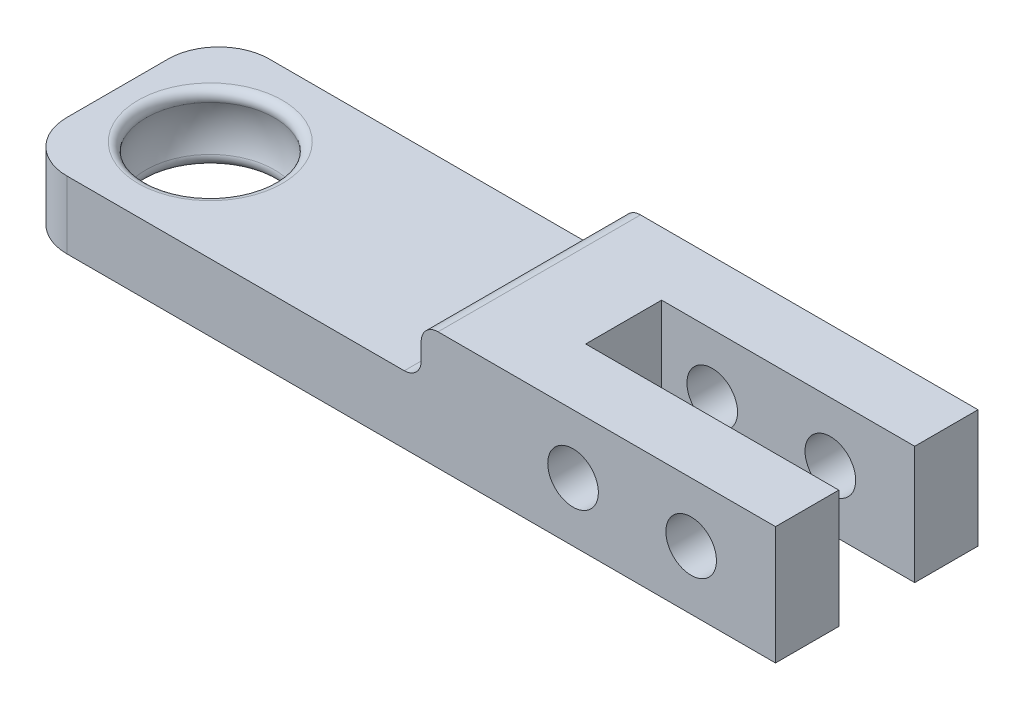
ISO-10303-21;
HEADER;
FILE_DESCRIPTION(('STEP AP214'),'2;1');
FILE_NAME('part.step','',(''),(''),'','','');
FILE_SCHEMA(('AUTOMOTIVE_DESIGN { 1 0 10303 214 1 1 1 1 }'));
ENDSEC;
DATA;
#1=APPLICATION_CONTEXT('core data for automotive mechanical design processes');
#2=APPLICATION_PROTOCOL_DEFINITION('international standard','automotive_design',2000,#1);
#3=PRODUCT_CONTEXT('',#1,'mechanical');
#4=PRODUCT('Part','Part','',(#3));
#5=PRODUCT_RELATED_PRODUCT_CATEGORY('part','',(#4));
#6=PRODUCT_DEFINITION_FORMATION('','',#4);
#7=PRODUCT_DEFINITION_CONTEXT('part definition',#1,'design');
#8=PRODUCT_DEFINITION('design','',#6,#7);
#9=PRODUCT_DEFINITION_SHAPE('','',#8);
#10=(LENGTH_UNIT() NAMED_UNIT(*) SI_UNIT(.MILLI.,.METRE.));
#11=(NAMED_UNIT(*) PLANE_ANGLE_UNIT() SI_UNIT($,.RADIAN.));
#12=(NAMED_UNIT(*) SI_UNIT($,.STERADIAN.) SOLID_ANGLE_UNIT());
#13=UNCERTAINTY_MEASURE_WITH_UNIT(LENGTH_MEASURE(1.E-05),#10,'distance_accuracy_value','');
#14=(GEOMETRIC_REPRESENTATION_CONTEXT(3) GLOBAL_UNCERTAINTY_ASSIGNED_CONTEXT((#13)) GLOBAL_UNIT_ASSIGNED_CONTEXT((#10,
#11,#12)) REPRESENTATION_CONTEXT('',''));
#15=CARTESIAN_POINT('',(0.,0.,0.));
#16=DIRECTION('',(0.,0.,1.));
#17=DIRECTION('',(1.,0.,0.));
#18=AXIS2_PLACEMENT_3D('',#15,#16,#17);
#19=CARTESIAN_POINT('',(22.5,2.,-6.));
#20=DIRECTION('',(-1.,0.,0.));
#21=DIRECTION('',(0.,0.,1.));
#22=AXIS2_PLACEMENT_3D('',#19,#20,#21);
#23=PLANE('',#22);
#24=DIRECTION('',(0.,1.,0.));
#25=VECTOR('',#24,1.);
#26=CARTESIAN_POINT('',(22.5,2.,-2.25));
#27=LINE('',#26,#25);
#28=CARTESIAN_POINT('',(22.5,-2.,-2.25));
#29=VERTEX_POINT('',#28);
#30=CARTESIAN_POINT('',(22.5,5.,-2.25));
#31=VERTEX_POINT('',#30);
#32=EDGE_CURVE('E194',#29,#31,#27,.T.);
#33=ORIENTED_EDGE('',*,*,#32,.F.);
#34=DIRECTION('',(0.,0.,1.));
#35=VECTOR('',#34,1.);
#36=CARTESIAN_POINT('',(22.5,-2.,-6.));
#37=LINE('',#36,#35);
#38=CARTESIAN_POINT('',(22.5,-2.,-6.));
#39=VERTEX_POINT('',#38);
#40=EDGE_CURVE('E149',#29,#39,#37,.F.);
#41=ORIENTED_EDGE('',*,*,#40,.T.);
#42=DIRECTION('',(0.,-1.,0.));
#43=VECTOR('',#42,1.);
#44=CARTESIAN_POINT('',(22.5,2.,-6.));
#45=LINE('',#44,#43);
#46=CARTESIAN_POINT('',(22.5,5.,-6.));
#47=VERTEX_POINT('',#46);
#48=EDGE_CURVE('E141',#47,#39,#45,.T.);
#49=ORIENTED_EDGE('',*,*,#48,.F.);
#50=DIRECTION('',(0.,0.,-1.));
#51=VECTOR('',#50,1.);
#52=CARTESIAN_POINT('',(22.5,5.,-2.25));
#53=LINE('',#52,#51);
#54=EDGE_CURVE('E150',#31,#47,#53,.T.);
#55=ORIENTED_EDGE('',*,*,#54,.F.);
#56=EDGE_LOOP('',(#33,#41,#49,#55));
#57=FACE_BOUND('',#56,.T.);
#58=ADVANCED_FACE('F41',(#57),#23,.F.);
#59=DIRECTION('',(0.,-1.,0.));
#60=VECTOR('',#59,1.);
#61=CARTESIAN_POINT('',(22.5,2.,2.25));
#62=LINE('',#61,#60);
#63=CARTESIAN_POINT('',(22.5,5.,2.25));
#64=VERTEX_POINT('',#63);
#65=CARTESIAN_POINT('',(22.5,-2.,2.25));
#66=VERTEX_POINT('',#65);
#67=EDGE_CURVE('E199',#64,#66,#62,.T.);
#68=ORIENTED_EDGE('',*,*,#67,.F.);
#69=DIRECTION('',(0.,0.,-1.));
#70=VECTOR('',#69,1.);
#71=CARTESIAN_POINT('',(22.5,5.,2.25));
#72=LINE('',#71,#70);
#73=CARTESIAN_POINT('',(22.5,5.,6.));
#74=VERTEX_POINT('',#73);
#75=EDGE_CURVE('E173',#74,#64,#72,.T.);
#76=ORIENTED_EDGE('',*,*,#75,.F.);
#77=DIRECTION('',(0.,-1.,0.));
#78=VECTOR('',#77,1.);
#79=CARTESIAN_POINT('',(22.5,2.,6.));
#80=LINE('',#79,#78);
#81=CARTESIAN_POINT('',(22.5,-2.,6.));
#82=VERTEX_POINT('',#81);
#83=EDGE_CURVE('E155',#74,#82,#80,.T.);
#84=ORIENTED_EDGE('',*,*,#83,.T.);
#85=DIRECTION('',(0.,0.,1.));
#86=VECTOR('',#85,1.);
#87=CARTESIAN_POINT('',(22.5,-2.,-6.));
#88=LINE('',#87,#86);
#89=EDGE_CURVE('E252',#82,#66,#88,.F.);
#90=ORIENTED_EDGE('',*,*,#89,.T.);
#91=EDGE_LOOP('',(#68,#76,#84,#90));
#92=FACE_BOUND('',#91,.T.);
#93=ADVANCED_FACE('F297',(#92),#23,.F.);
#94=CARTESIAN_POINT('',(0.,-2.,0.));
#95=DIRECTION('',(0.,1.,0.));
#96=DIRECTION('',(0.,0.,1.));
#97=AXIS2_PLACEMENT_3D('',#94,#95,#96);
#98=PLANE('',#97);
#99=CARTESIAN_POINT('',(-17.,-2.,0.));
#100=DIRECTION('',(0.,1.,0.));
#101=DIRECTION('',(0.,0.,1.));
#102=AXIS2_PLACEMENT_3D('',#99,#100,#101);
#103=CIRCLE('',#102,4.27564367951181);
#104=CARTESIAN_POINT('',(-17.,-2.,4.27564367951181));
#105=VERTEX_POINT('',#104);
#106=EDGE_CURVE('E238',#105,#105,#103,.T.);
#107=ORIENTED_EDGE('',*,*,#106,.T.);
#108=EDGE_LOOP('',(#107));
#109=FACE_BOUND('',#108,.T.);
#110=DIRECTION('',(-1.,0.,0.));
#111=VECTOR('',#110,1.);
#112=CARTESIAN_POINT('',(22.500012,-2.,2.25));
#113=LINE('',#112,#111);
#114=CARTESIAN_POINT('',(7.5,-2.,2.25));
#115=VERTEX_POINT('',#114);
#116=EDGE_CURVE('E197',#66,#115,#113,.T.);
#117=ORIENTED_EDGE('',*,*,#116,.F.);
#118=ORIENTED_EDGE('',*,*,#89,.F.);
#119=DIRECTION('',(1.,0.,0.));
#120=VECTOR('',#119,1.);
#121=CARTESIAN_POINT('',(-22.5,-2.,6.));
#122=LINE('',#121,#120);
#123=CARTESIAN_POINT('',(-19.5,-2.,6.));
#124=VERTEX_POINT('',#123);
#125=EDGE_CURVE('E212',#124,#82,#122,.T.);
#126=ORIENTED_EDGE('',*,*,#125,.F.);
#127=CARTESIAN_POINT('',(-19.5,-2.,3.));
#128=DIRECTION('',(0.,1.,0.));
#129=DIRECTION('',(0.,0.,1.));
#130=AXIS2_PLACEMENT_3D('',#127,#128,#129);
#131=CIRCLE('',#130,3.);
#132=CARTESIAN_POINT('',(-22.5,-2.,3.));
#133=VERTEX_POINT('',#132);
#134=EDGE_CURVE('E220',#124,#133,#131,.F.);
#135=ORIENTED_EDGE('',*,*,#134,.T.);
#136=DIRECTION('',(0.,0.,1.));
#137=VECTOR('',#136,1.);
#138=CARTESIAN_POINT('',(-22.5,-2.,-6.));
#139=LINE('',#138,#137);
#140=CARTESIAN_POINT('',(-22.5,-2.,-3.));
#141=VERTEX_POINT('',#140);
#142=EDGE_CURVE('E209',#141,#133,#139,.T.);
#143=ORIENTED_EDGE('',*,*,#142,.F.);
#144=CARTESIAN_POINT('',(-19.5,-2.,-3.));
#145=DIRECTION('',(0.,1.,0.));
#146=DIRECTION('',(0.,0.,1.));
#147=AXIS2_PLACEMENT_3D('',#144,#145,#146);
#148=CIRCLE('',#147,3.);
#149=CARTESIAN_POINT('',(-19.5,-2.,-6.));
#150=VERTEX_POINT('',#149);
#151=EDGE_CURVE('E216',#141,#150,#148,.F.);
#152=ORIENTED_EDGE('',*,*,#151,.T.);
#153=DIRECTION('',(-1.,0.,0.));
#154=VECTOR('',#153,1.);
#155=CARTESIAN_POINT('',(-22.5,-2.,-6.));
#156=LINE('',#155,#154);
#157=EDGE_CURVE('E215',#39,#150,#156,.T.);
#158=ORIENTED_EDGE('',*,*,#157,.F.);
#159=ORIENTED_EDGE('',*,*,#40,.F.);
#160=DIRECTION('',(-1.,0.,0.));
#161=VECTOR('',#160,1.);
#162=CARTESIAN_POINT('',(22.500012,-2.,-2.25));
#163=LINE('',#162,#161);
#164=CARTESIAN_POINT('',(7.5,-2.,-2.25));
#165=VERTEX_POINT('',#164);
#166=EDGE_CURVE('E196',#29,#165,#163,.T.);
#167=ORIENTED_EDGE('',*,*,#166,.T.);
#168=DIRECTION('',(0.,0.,-1.));
#169=VECTOR('',#168,1.);
#170=CARTESIAN_POINT('',(7.5,-2.,2.25));
#171=LINE('',#170,#169);
#172=EDGE_CURVE('E195',#115,#165,#171,.T.);
#173=ORIENTED_EDGE('',*,*,#172,.F.);
#174=EDGE_LOOP('',(#117,#118,#126,#135,#143,#152,#158,#159,#167,#173));
#175=FACE_BOUND('',#174,.T.);
#176=ADVANCED_FACE('F306',(#109,#175),#98,.F.);
#177=CARTESIAN_POINT('',(-22.5,2.,-6.));
#178=DIRECTION('',(0.,0.,1.));
#179=DIRECTION('',(1.,0.,0.));
#180=AXIS2_PLACEMENT_3D('',#177,#178,#179);
#181=PLANE('',#180);
#182=CARTESIAN_POINT('',(17.5,1.5,-6.));
#183=DIRECTION('',(0.,0.,-1.));
#184=DIRECTION('',(-1.,0.,0.));
#185=AXIS2_PLACEMENT_3D('',#182,#183,#184);
#186=CIRCLE('',#185,1.5);
#187=CARTESIAN_POINT('',(16.,1.5,-6.));
#188=VERTEX_POINT('',#187);
#189=EDGE_CURVE('E388',#188,#188,#186,.T.);
#190=ORIENTED_EDGE('',*,*,#189,.F.);
#191=EDGE_LOOP('',(#190));
#192=FACE_BOUND('',#191,.T.);
#193=CARTESIAN_POINT('',(10.5,1.5,-6.));
#194=DIRECTION('',(0.,0.,-1.));
#195=DIRECTION('',(-1.,0.,0.));
#196=AXIS2_PLACEMENT_3D('',#193,#194,#195);
#197=CIRCLE('',#196,1.5);
#198=CARTESIAN_POINT('',(9.,1.5,-6.));
#199=VERTEX_POINT('',#198);
#200=EDGE_CURVE('E392',#199,#199,#197,.T.);
#201=ORIENTED_EDGE('',*,*,#200,.F.);
#202=EDGE_LOOP('',(#201));
#203=FACE_BOUND('',#202,.T.);
#204=DIRECTION('',(0.,-1.,0.));
#205=VECTOR('',#204,1.);
#206=CARTESIAN_POINT('',(1.5,5.,-6.));
#207=LINE('',#206,#205);
#208=CARTESIAN_POINT('',(1.5,4.,-6.));
#209=VERTEX_POINT('',#208);
#210=CARTESIAN_POINT('',(1.5,3.,-6.));
#211=VERTEX_POINT('',#210);
#212=EDGE_CURVE('E184',#209,#211,#207,.T.);
#213=ORIENTED_EDGE('',*,*,#212,.F.);
#214=CARTESIAN_POINT('',(2.5,4.,-6.));
#215=DIRECTION('',(0.,0.,1.));
#216=DIRECTION('',(1.,0.,0.));
#217=AXIS2_PLACEMENT_3D('',#214,#215,#216);
#218=CIRCLE('',#217,1.);
#219=CARTESIAN_POINT('',(2.50000000000001,5.,-6.));
#220=VERTEX_POINT('',#219);
#221=EDGE_CURVE('E61',#209,#220,#218,.F.);
#222=ORIENTED_EDGE('',*,*,#221,.T.);
#223=DIRECTION('',(-1.,0.,0.));
#224=VECTOR('',#223,1.);
#225=CARTESIAN_POINT('',(22.5,5.,-6.));
#226=LINE('',#225,#224);
#227=EDGE_CURVE('E153',#47,#220,#226,.T.);
#228=ORIENTED_EDGE('',*,*,#227,.F.);
#229=ORIENTED_EDGE('',*,*,#48,.T.);
#230=ORIENTED_EDGE('',*,*,#157,.T.);
#231=DIRECTION('',(0.,-1.,0.));
#232=VECTOR('',#231,1.);
#233=CARTESIAN_POINT('',(-19.5,2.,-6.));
#234=LINE('',#233,#232);
#235=CARTESIAN_POINT('',(-19.5,2.,-6.));
#236=VERTEX_POINT('',#235);
#237=EDGE_CURVE('E222',#150,#236,#234,.F.);
#238=ORIENTED_EDGE('',*,*,#237,.T.);
#239=DIRECTION('',(-1.,0.,0.));
#240=VECTOR('',#239,1.);
#241=CARTESIAN_POINT('',(-22.5,2.,-6.));
#242=LINE('',#241,#240);
#243=CARTESIAN_POINT('',(0.49999999999999,2.,-6.));
#244=VERTEX_POINT('',#243);
#245=EDGE_CURVE('E210',#244,#236,#242,.T.);
#246=ORIENTED_EDGE('',*,*,#245,.F.);
#247=CARTESIAN_POINT('',(0.499999999999998,3.,-6.));
#248=DIRECTION('',(0.,0.,1.));
#249=DIRECTION('',(1.,0.,0.));
#250=AXIS2_PLACEMENT_3D('',#247,#248,#249);
#251=CIRCLE('',#250,1.);
#252=EDGE_CURVE('E11',#244,#211,#251,.T.);
#253=ORIENTED_EDGE('',*,*,#252,.T.);
#254=EDGE_LOOP('',(#213,#222,#228,#229,#230,#238,#246,#253));
#255=FACE_BOUND('',#254,.T.);
#256=ADVANCED_FACE('F157',(#192,#203,#255),#181,.F.);
#257=CARTESIAN_POINT('',(-22.5,2.,-6.));
#258=DIRECTION('',(1.,0.,0.));
#259=DIRECTION('',(0.,0.,-1.));
#260=AXIS2_PLACEMENT_3D('',#257,#258,#259);
#261=PLANE('',#260);
#262=DIRECTION('',(0.,0.,1.));
#263=VECTOR('',#262,1.);
#264=CARTESIAN_POINT('',(-22.5,2.,-6.));
#265=LINE('',#264,#263);
#266=CARTESIAN_POINT('',(-22.5,2.,-3.));
#267=VERTEX_POINT('',#266);
#268=CARTESIAN_POINT('',(-22.5,2.,3.));
#269=VERTEX_POINT('',#268);
#270=EDGE_CURVE('E202',#267,#269,#265,.T.);
#271=ORIENTED_EDGE('',*,*,#270,.F.);
#272=DIRECTION('',(0.,-1.,0.));
#273=VECTOR('',#272,1.);
#274=CARTESIAN_POINT('',(-22.5,2.,-3.));
#275=LINE('',#274,#273);
#276=EDGE_CURVE('E211',#267,#141,#275,.T.);
#277=ORIENTED_EDGE('',*,*,#276,.T.);
#278=ORIENTED_EDGE('',*,*,#142,.T.);
#279=DIRECTION('',(0.,-1.,0.));
#280=VECTOR('',#279,1.);
#281=CARTESIAN_POINT('',(-22.5,2.,3.));
#282=LINE('',#281,#280);
#283=EDGE_CURVE('E154',#133,#269,#282,.F.);
#284=ORIENTED_EDGE('',*,*,#283,.T.);
#285=EDGE_LOOP('',(#271,#277,#278,#284));
#286=FACE_BOUND('',#285,.T.);
#287=ADVANCED_FACE('F320',(#286),#261,.F.);
#288=CARTESIAN_POINT('',(-22.5,2.,6.));
#289=DIRECTION('',(0.,0.,-1.));
#290=DIRECTION('',(-1.,0.,0.));
#291=AXIS2_PLACEMENT_3D('',#288,#289,#290);
#292=PLANE('',#291);
#293=CARTESIAN_POINT('',(17.5,1.5,6.));
#294=DIRECTION('',(0.,0.,-1.));
#295=DIRECTION('',(-1.,0.,0.));
#296=AXIS2_PLACEMENT_3D('',#293,#294,#295);
#297=CIRCLE('',#296,1.5);
#298=CARTESIAN_POINT('',(16.,1.5,6.));
#299=VERTEX_POINT('',#298);
#300=EDGE_CURVE('E263',#299,#299,#297,.T.);
#301=ORIENTED_EDGE('',*,*,#300,.T.);
#302=EDGE_LOOP('',(#301));
#303=FACE_BOUND('',#302,.T.);
#304=CARTESIAN_POINT('',(10.5,1.5,6.));
#305=DIRECTION('',(0.,0.,-1.));
#306=DIRECTION('',(-1.,0.,0.));
#307=AXIS2_PLACEMENT_3D('',#304,#305,#306);
#308=CIRCLE('',#307,1.5);
#309=CARTESIAN_POINT('',(9.,1.5,6.));
#310=VERTEX_POINT('',#309);
#311=EDGE_CURVE('E397',#310,#310,#308,.T.);
#312=ORIENTED_EDGE('',*,*,#311,.T.);
#313=EDGE_LOOP('',(#312));
#314=FACE_BOUND('',#313,.T.);
#315=DIRECTION('',(1.,0.,0.));
#316=VECTOR('',#315,1.);
#317=CARTESIAN_POINT('',(1.5,5.,6.));
#318=LINE('',#317,#316);
#319=CARTESIAN_POINT('',(2.5,5.,6.));
#320=VERTEX_POINT('',#319);
#321=EDGE_CURVE('E156',#320,#74,#318,.T.);
#322=ORIENTED_EDGE('',*,*,#321,.F.);
#323=CARTESIAN_POINT('',(2.5,4.,6.));
#324=DIRECTION('',(0.,0.,-1.));
#325=DIRECTION('',(-1.,0.,0.));
#326=AXIS2_PLACEMENT_3D('',#323,#324,#325);
#327=CIRCLE('',#326,1.);
#328=CARTESIAN_POINT('',(1.5,4.,6.));
#329=VERTEX_POINT('',#328);
#330=EDGE_CURVE('E57',#320,#329,#327,.F.);
#331=ORIENTED_EDGE('',*,*,#330,.T.);
#332=DIRECTION('',(0.,-1.,0.));
#333=VECTOR('',#332,1.);
#334=CARTESIAN_POINT('',(1.5,5.,6.));
#335=LINE('',#334,#333);
#336=CARTESIAN_POINT('',(1.5,3.,6.));
#337=VERTEX_POINT('',#336);
#338=EDGE_CURVE('E182',#329,#337,#335,.T.);
#339=ORIENTED_EDGE('',*,*,#338,.T.);
#340=CARTESIAN_POINT('',(0.499999999999998,3.,6.));
#341=DIRECTION('',(0.,0.,-1.));
#342=DIRECTION('',(-1.,0.,0.));
#343=AXIS2_PLACEMENT_3D('',#340,#341,#342);
#344=CIRCLE('',#343,1.);
#345=CARTESIAN_POINT('',(0.49999999999999,2.,6.));
#346=VERTEX_POINT('',#345);
#347=EDGE_CURVE('E47',#337,#346,#344,.T.);
#348=ORIENTED_EDGE('',*,*,#347,.T.);
#349=DIRECTION('',(1.,0.,0.));
#350=VECTOR('',#349,1.);
#351=CARTESIAN_POINT('',(-22.5,2.,6.));
#352=LINE('',#351,#350);
#353=CARTESIAN_POINT('',(-19.5,2.,6.));
#354=VERTEX_POINT('',#353);
#355=EDGE_CURVE('E207',#354,#346,#352,.T.);
#356=ORIENTED_EDGE('',*,*,#355,.F.);
#357=DIRECTION('',(0.,-1.,0.));
#358=VECTOR('',#357,1.);
#359=CARTESIAN_POINT('',(-19.5,2.,6.));
#360=LINE('',#359,#358);
#361=EDGE_CURVE('E230',#354,#124,#360,.T.);
#362=ORIENTED_EDGE('',*,*,#361,.T.);
#363=ORIENTED_EDGE('',*,*,#125,.T.);
#364=ORIENTED_EDGE('',*,*,#83,.F.);
#365=EDGE_LOOP('',(#322,#331,#339,#348,#356,#362,#363,#364));
#366=FACE_BOUND('',#365,.T.);
#367=ADVANCED_FACE('F276',(#303,#314,#366),#292,.F.);
#368=CARTESIAN_POINT('',(0.,2.,0.));
#369=DIRECTION('',(0.,1.,0.));
#370=DIRECTION('',(0.,0.,1.));
#371=AXIS2_PLACEMENT_3D('',#368,#369,#370);
#372=PLANE('',#371);
#373=ORIENTED_EDGE('',*,*,#355,.T.);
#374=DIRECTION('',(0.,0.,1.));
#375=VECTOR('',#374,1.);
#376=CARTESIAN_POINT('',(0.499999999999998,2.,0.));
#377=LINE('',#376,#375);
#378=EDGE_CURVE('E268',#346,#244,#377,.F.);
#379=ORIENTED_EDGE('',*,*,#378,.T.);
#380=ORIENTED_EDGE('',*,*,#245,.T.);
#381=CARTESIAN_POINT('',(-19.5,2.,-3.));
#382=DIRECTION('',(0.,1.,0.));
#383=DIRECTION('',(0.,0.,1.));
#384=AXIS2_PLACEMENT_3D('',#381,#382,#383);
#385=CIRCLE('',#384,3.);
#386=EDGE_CURVE('E227',#236,#267,#385,.T.);
#387=ORIENTED_EDGE('',*,*,#386,.T.);
#388=ORIENTED_EDGE('',*,*,#270,.T.);
#389=CARTESIAN_POINT('',(-19.5,2.,3.));
#390=DIRECTION('',(0.,1.,0.));
#391=DIRECTION('',(0.,0.,1.));
#392=AXIS2_PLACEMENT_3D('',#389,#390,#391);
#393=CIRCLE('',#392,3.);
#394=EDGE_CURVE('E224',#269,#354,#393,.T.);
#395=ORIENTED_EDGE('',*,*,#394,.T.);
#396=EDGE_LOOP('',(#373,#379,#380,#387,#388,#395));
#397=FACE_BOUND('',#396,.T.);
#398=CARTESIAN_POINT('',(-17.,2.,0.));
#399=DIRECTION('',(0.,1.,0.));
#400=DIRECTION('',(0.,0.,1.));
#401=AXIS2_PLACEMENT_3D('',#398,#399,#400);
#402=CIRCLE('',#401,4.27564367951181);
#403=CARTESIAN_POINT('',(-17.,2.,4.27564367951181));
#404=VERTEX_POINT('',#403);
#405=EDGE_CURVE('E240',#404,#404,#402,.F.);
#406=ORIENTED_EDGE('',*,*,#405,.T.);
#407=EDGE_LOOP('',(#406));
#408=FACE_BOUND('',#407,.T.);
#409=ADVANCED_FACE('F284',(#397,#408),#372,.T.);
#410=CARTESIAN_POINT('',(-17.,0.,0.));
#411=DIRECTION('',(0.,1.,0.));
#412=DIRECTION('',(-1.,0.,0.));
#413=AXIS2_PLACEMENT_3D('',#410,#411,#412);
#414=SPHERICAL_SURFACE('',#413,4.03112887414927);
#415=CARTESIAN_POINT('',(-17.,1.33447833402425,0.));
#416=DIRECTION('',(0.,-1.,0.));
#417=DIRECTION('',(0.,0.,-1.));
#418=AXIS2_PLACEMENT_3D('',#415,#416,#417);
#419=CIRCLE('',#418,3.80383590287749);
#420=CARTESIAN_POINT('',(-20.8038359028775,1.33447833402425,0.));
#421=VERTEX_POINT('',#420);
#422=EDGE_CURVE('E234',#421,#421,#419,.F.);
#423=CARTESIAN_POINT('',(-17.,-1.33447833402425,0.));
#424=DIRECTION('',(0.,1.,0.));
#425=DIRECTION('',(0.,0.,1.));
#426=AXIS2_PLACEMENT_3D('',#423,#424,#425);
#427=CIRCLE('',#426,3.80383590287749);
#428=CARTESIAN_POINT('',(-20.8038359028775,-1.33447833402425,0.));
#429=VERTEX_POINT('',#428);
#430=EDGE_CURVE('E232',#429,#429,#427,.F.);
#431=CARTESIAN_POINT('',(-20.8038359028775,1.33447833402425,0.));
#432=CARTESIAN_POINT('',(-20.813216470049,1.30773983630377,0.));
#433=CARTESIAN_POINT('',(-20.8223150164849,1.28090240068326,0.));
#434=CARTESIAN_POINT('',(-20.8399442210205,1.22704165317102,0.));
#435=CARTESIAN_POINT('',(-20.8484748791202,1.2000183412793,0.));
#436=CARTESIAN_POINT('',(-20.8649644601183,1.14579784075353,0.));
#437=CARTESIAN_POINT('',(-20.8729233830168,1.11860065211948,0.));
#438=CARTESIAN_POINT('',(-20.8882659686585,1.06404449710711,0.));
#439=CARTESIAN_POINT('',(-20.8956496314019,1.0366855307288,0.));
#440=CARTESIAN_POINT('',(-20.909838409461,0.981817985232398,0.));
#441=CARTESIAN_POINT('',(-20.9166435247767,0.954309406114316,0.));
#442=CARTESIAN_POINT('',(-20.9296721828406,0.899154868264313,0.));
#443=CARTESIAN_POINT('',(-20.9358957255887,0.871508909532394,0.));
#444=CARTESIAN_POINT('',(-20.9477584706951,0.816091906245911,0.));
#445=CARTESIAN_POINT('',(-20.9533976730534,0.788320861691347,0.));
#446=CARTESIAN_POINT('',(-20.9640892297568,0.732666036289348,0.));
#447=CARTESIAN_POINT('',(-20.969141584102,0.704782255441913,0.));
#448=CARTESIAN_POINT('',(-20.9786571980282,0.648914357086056,0.));
#449=CARTESIAN_POINT('',(-20.9831204576092,0.620930239577633,0.));
#450=CARTESIAN_POINT('',(-20.9914558972453,0.564874112158591,0.));
#451=CARTESIAN_POINT('',(-20.9953280773004,0.53680210224797,0.));
#452=CARTESIAN_POINT('',(-21.0024796359638,0.480582673365998,0.));
#453=CARTESIAN_POINT('',(-21.005759014572,0.452435254394645,0.));
#454=CARTESIAN_POINT('',(-21.011723512035,0.396077524266916,0.));
#455=CARTESIAN_POINT('',(-21.0144086308897,0.36786721311054,0.));
#456=CARTESIAN_POINT('',(-21.0191834148002,0.31139624345584,0.));
#457=CARTESIAN_POINT('',(-21.021273079856,0.283135584957516,0.));
#458=CARTESIAN_POINT('',(-21.0248560269154,0.226576487850998,0.));
#459=CARTESIAN_POINT('',(-21.026349308919,0.198278049242805,0.));
#460=CARTESIAN_POINT('',(-21.0287388258265,0.141655975949051,0.));
#461=CARTESIAN_POINT('',(-21.0296350607304,0.113332341263491,0.));
#462=CARTESIAN_POINT('',(-21.0308300848918,0.0566724710519537,0.));
#463=CARTESIAN_POINT('',(-21.0311288741493,0.0283362355259769,0.));
#464=CARTESIAN_POINT('',(-21.0311288741493,-0.0283362355259769,0.));
#465=CARTESIAN_POINT('',(-21.0308300848918,-0.0566724710519537,0.));
#466=CARTESIAN_POINT('',(-21.0296350607304,-0.113332341263491,0.));
#467=CARTESIAN_POINT('',(-21.0287388258265,-0.141655975949051,0.));
#468=CARTESIAN_POINT('',(-21.026349308919,-0.198278049242805,0.));
#469=CARTESIAN_POINT('',(-21.0248560269154,-0.226576487850998,0.));
#470=CARTESIAN_POINT('',(-21.021273079856,-0.283135584957516,0.));
#471=CARTESIAN_POINT('',(-21.0191834148002,-0.31139624345584,0.));
#472=CARTESIAN_POINT('',(-21.0144086308897,-0.36786721311054,0.));
#473=CARTESIAN_POINT('',(-21.011723512035,-0.396077524266916,0.));
#474=CARTESIAN_POINT('',(-21.005759014572,-0.452435254394645,0.));
#475=CARTESIAN_POINT('',(-21.0024796359638,-0.480582673365998,0.));
#476=CARTESIAN_POINT('',(-20.9953280773004,-0.536802102247971,0.));
#477=CARTESIAN_POINT('',(-20.9914558972453,-0.564874112158591,0.));
#478=CARTESIAN_POINT('',(-20.9831204576092,-0.620930239577633,0.));
#479=CARTESIAN_POINT('',(-20.9786571980282,-0.648914357086056,0.));
#480=CARTESIAN_POINT('',(-20.969141584102,-0.704782255441913,0.));
#481=CARTESIAN_POINT('',(-20.9640892297568,-0.732666036289348,0.));
#482=CARTESIAN_POINT('',(-20.9533976730534,-0.788320861691347,0.));
#483=CARTESIAN_POINT('',(-20.9477584706951,-0.816091906245911,0.));
#484=CARTESIAN_POINT('',(-20.9358957255887,-0.871508909532394,0.));
#485=CARTESIAN_POINT('',(-20.9296721828406,-0.899154868264313,0.));
#486=CARTESIAN_POINT('',(-20.9166435247767,-0.954309406114316,0.));
#487=CARTESIAN_POINT('',(-20.909838409461,-0.981817985232398,0.));
#488=CARTESIAN_POINT('',(-20.8956496314019,-1.0366855307288,0.));
#489=CARTESIAN_POINT('',(-20.8882659686585,-1.06404449710711,0.));
#490=CARTESIAN_POINT('',(-20.8729233830168,-1.11860065211948,0.));
#491=CARTESIAN_POINT('',(-20.8649644601183,-1.14579784075353,0.));
#492=CARTESIAN_POINT('',(-20.8484748791202,-1.2000183412793,0.));
#493=CARTESIAN_POINT('',(-20.8399442210205,-1.22704165317102,0.));
#494=CARTESIAN_POINT('',(-20.8223150164849,-1.28090240068326,0.));
#495=CARTESIAN_POINT('',(-20.813216470049,-1.30773983630377,0.));
#496=CARTESIAN_POINT('',(-20.8038359028775,-1.33447833402425,0.));
#497=B_SPLINE_CURVE_WITH_KNOTS('',3,(#431,#432,#433,#434,#435,#436,#437,#438,#439,#440,#441,
#442,#443,#444,#445,#446,#447,#448,#449,#450,#451,#452,#453,#454,#455,#456,#457,#458,#459,#460,
#461,#462,#463,#464,#465,#466,#467,#468,#469,#470,#471,#472,#473,#474,#475,#476,#477,#478,#479,
#480,#481,#482,#483,#484,#485,#486,#487,#488,#489,#490,#491,#492,#493,#494,#495,#496),
.UNSPECIFIED.,.F.,.F.,(4,2,2,2,2,2,2,2,2,2,2,2,2,2,2,2,2,2,2,2,2,2,2,2,2,2,2,2,2,2,2,2,4),(0.,
0.0850071315166637,0.170014263033326,0.25502139454999,0.340028526066653,0.425035657583315,
0.510042789099978,0.595049920616642,0.680057052133304,0.765064183649967,0.85007131516663,
0.935078446683293,1.02008557819996,1.10509270971662,1.19009984123328,1.27510697274994,
1.36011410426661,1.44512123578327,1.53012836729993,1.6151354988166,1.70014263033326,
1.78514976184992,1.87015689336658,1.95516402488325,2.04017115639991,2.12517828791657,
2.21018541943324,2.2951925509499,2.38019968246656,2.46520681398323,2.55021394549989,
2.63522107701655,2.72022820853321),.UNSPECIFIED.);
#498=EDGE_CURVE('BSEAM332',#421,#429,#497,.T.);
#499=ORIENTED_EDGE('',*,*,#422,.T.);
#500=ORIENTED_EDGE('',*,*,#430,.T.);
#501=ORIENTED_EDGE('',*,*,#498,.T.);
#502=ORIENTED_EDGE('',*,*,#498,.F.);
#503=EDGE_LOOP('',(#499,#501,#500,#502));
#504=FACE_BOUND('',#503,.T.);
#505=ADVANCED_FACE('F332',(#504),#414,.F.);
#506=CARTESIAN_POINT('',(-19.5,2.,-3.));
#507=DIRECTION('',(0.,-1.,0.));
#508=DIRECTION('',(0.,0.,-1.));
#509=AXIS2_PLACEMENT_3D('',#506,#507,#508);
#510=CYLINDRICAL_SURFACE('',#509,3.);
#511=ORIENTED_EDGE('',*,*,#386,.F.);
#512=ORIENTED_EDGE('',*,*,#237,.F.);
#513=ORIENTED_EDGE('',*,*,#151,.F.);
#514=ORIENTED_EDGE('',*,*,#276,.F.);
#515=EDGE_LOOP('',(#511,#512,#513,#514));
#516=FACE_BOUND('',#515,.T.);
#517=ADVANCED_FACE('F314',(#516),#510,.T.);
#518=CARTESIAN_POINT('',(-19.5,2.,3.));
#519=DIRECTION('',(0.,-1.,0.));
#520=DIRECTION('',(0.,0.,-1.));
#521=AXIS2_PLACEMENT_3D('',#518,#519,#520);
#522=CYLINDRICAL_SURFACE('',#521,3.);
#523=ORIENTED_EDGE('',*,*,#394,.F.);
#524=ORIENTED_EDGE('',*,*,#283,.F.);
#525=ORIENTED_EDGE('',*,*,#134,.F.);
#526=ORIENTED_EDGE('',*,*,#361,.F.);
#527=EDGE_LOOP('',(#523,#524,#525,#526));
#528=FACE_BOUND('',#527,.T.);
#529=ADVANCED_FACE('F318',(#528),#522,.T.);
#530=CARTESIAN_POINT('',(-17.,1.5,0.));
#531=DIRECTION('',(0.,1.,0.));
#532=DIRECTION('',(0.,0.,1.));
#533=AXIS2_PLACEMENT_3D('',#530,#531,#532);
#534=TOROIDAL_SURFACE('',#533,4.27564367951181,0.5);
#535=ORIENTED_EDGE('',*,*,#405,.F.);
#536=EDGE_LOOP('',(#535));
#537=FACE_BOUND('',#536,.T.);
#538=ORIENTED_EDGE('',*,*,#422,.F.);
#539=EDGE_LOOP('',(#538));
#540=FACE_BOUND('',#539,.T.);
#541=ADVANCED_FACE('F325',(#537,#540),#534,.T.);
#542=CARTESIAN_POINT('',(-17.,-1.5,0.));
#543=DIRECTION('',(0.,1.,0.));
#544=DIRECTION('',(0.,0.,1.));
#545=AXIS2_PLACEMENT_3D('',#542,#543,#544);
#546=TOROIDAL_SURFACE('',#545,4.27564367951181,0.5);
#547=ORIENTED_EDGE('',*,*,#430,.F.);
#548=EDGE_LOOP('',(#547));
#549=FACE_BOUND('',#548,.T.);
#550=ORIENTED_EDGE('',*,*,#106,.F.);
#551=EDGE_LOOP('',(#550));
#552=FACE_BOUND('',#551,.T.);
#553=ADVANCED_FACE('F326',(#549,#552),#546,.T.);
#554=CARTESIAN_POINT('',(22.500012,2.,-2.25));
#555=DIRECTION('',(0.,0.,1.));
#556=DIRECTION('',(1.,0.,0.));
#557=AXIS2_PLACEMENT_3D('',#554,#555,#556);
#558=PLANE('',#557);
#559=CARTESIAN_POINT('',(17.5,1.5,-2.25));
#560=DIRECTION('',(0.,0.,1.));
#561=DIRECTION('',(1.,0.,0.));
#562=AXIS2_PLACEMENT_3D('',#559,#560,#561);
#563=CIRCLE('',#562,1.5);
#564=CARTESIAN_POINT('',(19.,1.5,-2.25));
#565=VERTEX_POINT('',#564);
#566=EDGE_CURVE('E163',#565,#565,#563,.T.);
#567=ORIENTED_EDGE('',*,*,#566,.F.);
#568=EDGE_LOOP('',(#567));
#569=FACE_BOUND('',#568,.T.);
#570=CARTESIAN_POINT('',(10.5,1.5,-2.25));
#571=DIRECTION('',(0.,0.,1.));
#572=DIRECTION('',(1.,0.,0.));
#573=AXIS2_PLACEMENT_3D('',#570,#571,#572);
#574=CIRCLE('',#573,1.5);
#575=CARTESIAN_POINT('',(12.,1.5,-2.25));
#576=VERTEX_POINT('',#575);
#577=EDGE_CURVE('E259',#576,#576,#574,.T.);
#578=ORIENTED_EDGE('',*,*,#577,.F.);
#579=EDGE_LOOP('',(#578));
#580=FACE_BOUND('',#579,.T.);
#581=ORIENTED_EDGE('',*,*,#166,.F.);
#582=ORIENTED_EDGE('',*,*,#32,.T.);
#583=DIRECTION('',(1.,0.,0.));
#584=VECTOR('',#583,1.);
#585=CARTESIAN_POINT('',(22.5,5.,-2.25));
#586=LINE('',#585,#584);
#587=CARTESIAN_POINT('',(7.5,5.,-2.25));
#588=VERTEX_POINT('',#587);
#589=EDGE_CURVE('E161',#588,#31,#586,.T.);
#590=ORIENTED_EDGE('',*,*,#589,.F.);
#591=DIRECTION('',(0.,1.,0.));
#592=VECTOR('',#591,1.);
#593=CARTESIAN_POINT('',(7.5,2.,-2.25));
#594=LINE('',#593,#592);
#595=EDGE_CURVE('E186',#165,#588,#594,.T.);
#596=ORIENTED_EDGE('',*,*,#595,.F.);
#597=EDGE_LOOP('',(#581,#582,#590,#596));
#598=FACE_BOUND('',#597,.T.);
#599=ADVANCED_FACE('F307',(#569,#580,#598),#558,.T.);
#600=CARTESIAN_POINT('',(22.500012,2.,2.25));
#601=DIRECTION('',(0.,0.,-1.));
#602=DIRECTION('',(-1.,0.,0.));
#603=AXIS2_PLACEMENT_3D('',#600,#601,#602);
#604=PLANE('',#603);
#605=CARTESIAN_POINT('',(17.5,1.5,2.25));
#606=DIRECTION('',(0.,0.,-1.));
#607=DIRECTION('',(-1.,0.,0.));
#608=AXIS2_PLACEMENT_3D('',#605,#606,#607);
#609=CIRCLE('',#608,1.5);
#610=CARTESIAN_POINT('',(16.,1.5,2.25));
#611=VERTEX_POINT('',#610);
#612=EDGE_CURVE('E169',#611,#611,#609,.T.);
#613=ORIENTED_EDGE('',*,*,#612,.F.);
#614=EDGE_LOOP('',(#613));
#615=FACE_BOUND('',#614,.T.);
#616=CARTESIAN_POINT('',(10.5,1.5,2.25));
#617=DIRECTION('',(0.,0.,-1.));
#618=DIRECTION('',(-1.,0.,0.));
#619=AXIS2_PLACEMENT_3D('',#616,#617,#618);
#620=CIRCLE('',#619,1.5);
#621=CARTESIAN_POINT('',(9.,1.5,2.25));
#622=VERTEX_POINT('',#621);
#623=EDGE_CURVE('E257',#622,#622,#620,.T.);
#624=ORIENTED_EDGE('',*,*,#623,.F.);
#625=EDGE_LOOP('',(#624));
#626=FACE_BOUND('',#625,.T.);
#627=DIRECTION('',(0.,-1.,0.));
#628=VECTOR('',#627,1.);
#629=CARTESIAN_POINT('',(7.5,2.,2.25));
#630=LINE('',#629,#628);
#631=CARTESIAN_POINT('',(7.5,5.,2.25));
#632=VERTEX_POINT('',#631);
#633=EDGE_CURVE('E187',#632,#115,#630,.T.);
#634=ORIENTED_EDGE('',*,*,#633,.F.);
#635=DIRECTION('',(-1.,0.,0.));
#636=VECTOR('',#635,1.);
#637=CARTESIAN_POINT('',(7.5,5.,2.25));
#638=LINE('',#637,#636);
#639=EDGE_CURVE('E177',#64,#632,#638,.T.);
#640=ORIENTED_EDGE('',*,*,#639,.F.);
#641=ORIENTED_EDGE('',*,*,#67,.T.);
#642=ORIENTED_EDGE('',*,*,#116,.T.);
#643=EDGE_LOOP('',(#634,#640,#641,#642));
#644=FACE_BOUND('',#643,.T.);
#645=ADVANCED_FACE('F296',(#615,#626,#644),#604,.T.);
#646=CARTESIAN_POINT('',(7.5,0.,0.));
#647=DIRECTION('',(1.,0.,0.));
#648=DIRECTION('',(0.,0.,-1.));
#649=AXIS2_PLACEMENT_3D('',#646,#647,#648);
#650=PLANE('',#649);
#651=ORIENTED_EDGE('',*,*,#595,.T.);
#652=DIRECTION('',(0.,0.,-1.));
#653=VECTOR('',#652,1.);
#654=CARTESIAN_POINT('',(7.5,5.,-2.25));
#655=LINE('',#654,#653);
#656=EDGE_CURVE('E176',#632,#588,#655,.T.);
#657=ORIENTED_EDGE('',*,*,#656,.F.);
#658=ORIENTED_EDGE('',*,*,#633,.T.);
#659=ORIENTED_EDGE('',*,*,#172,.T.);
#660=EDGE_LOOP('',(#651,#657,#658,#659));
#661=FACE_BOUND('',#660,.T.);
#662=ADVANCED_FACE('F301',(#661),#650,.T.);
#663=CARTESIAN_POINT('',(1.5,5.,2.5));
#664=DIRECTION('',(1.,0.,0.));
#665=DIRECTION('',(0.,0.,-1.));
#666=AXIS2_PLACEMENT_3D('',#663,#664,#665);
#667=PLANE('',#666);
#668=ORIENTED_EDGE('',*,*,#212,.T.);
#669=DIRECTION('',(0.,0.,1.));
#670=VECTOR('',#669,1.);
#671=CARTESIAN_POINT('',(1.5,3.,2.5));
#672=LINE('',#671,#670);
#673=EDGE_CURVE('E262',#211,#337,#672,.T.);
#674=ORIENTED_EDGE('',*,*,#673,.T.);
#675=ORIENTED_EDGE('',*,*,#338,.F.);
#676=DIRECTION('',(0.,0.,1.));
#677=VECTOR('',#676,1.);
#678=CARTESIAN_POINT('',(1.5,4.,-6.));
#679=LINE('',#678,#677);
#680=EDGE_CURVE('E244',#329,#209,#679,.F.);
#681=ORIENTED_EDGE('',*,*,#680,.T.);
#682=EDGE_LOOP('',(#668,#674,#675,#681));
#683=FACE_BOUND('',#682,.T.);
#684=ADVANCED_FACE('F288',(#683),#667,.F.);
#685=CARTESIAN_POINT('',(0.,5.,0.));
#686=DIRECTION('',(0.,1.,0.));
#687=DIRECTION('',(0.,0.,1.));
#688=AXIS2_PLACEMENT_3D('',#685,#686,#687);
#689=PLANE('',#688);
#690=ORIENTED_EDGE('',*,*,#227,.T.);
#691=DIRECTION('',(0.,0.,1.));
#692=VECTOR('',#691,1.);
#693=CARTESIAN_POINT('',(2.5,5.,6.));
#694=LINE('',#693,#692);
#695=EDGE_CURVE('E269',#220,#320,#694,.T.);
#696=ORIENTED_EDGE('',*,*,#695,.T.);
#697=ORIENTED_EDGE('',*,*,#321,.T.);
#698=ORIENTED_EDGE('',*,*,#75,.T.);
#699=ORIENTED_EDGE('',*,*,#639,.T.);
#700=ORIENTED_EDGE('',*,*,#656,.T.);
#701=ORIENTED_EDGE('',*,*,#589,.T.);
#702=ORIENTED_EDGE('',*,*,#54,.T.);
#703=EDGE_LOOP('',(#690,#696,#697,#698,#699,#700,#701,#702));
#704=FACE_BOUND('',#703,.T.);
#705=ADVANCED_FACE('F162',(#704),#689,.T.);
#706=CARTESIAN_POINT('',(10.5,1.5,6.));
#707=DIRECTION('',(0.,0.,-1.));
#708=DIRECTION('',(-1.,0.,0.));
#709=AXIS2_PLACEMENT_3D('',#706,#707,#708);
#710=CYLINDRICAL_SURFACE('',#709,1.5);
#711=ORIENTED_EDGE('',*,*,#623,.T.);
#712=EDGE_LOOP('',(#711));
#713=FACE_BOUND('',#712,.T.);
#714=ORIENTED_EDGE('',*,*,#311,.F.);
#715=EDGE_LOOP('',(#714));
#716=FACE_BOUND('',#715,.T.);
#717=ADVANCED_FACE('F370',(#713,#716),#710,.F.);
#718=CARTESIAN_POINT('',(17.5,1.5,6.));
#719=DIRECTION('',(0.,0.,-1.));
#720=DIRECTION('',(-1.,0.,0.));
#721=AXIS2_PLACEMENT_3D('',#718,#719,#720);
#722=CYLINDRICAL_SURFACE('',#721,1.5);
#723=ORIENTED_EDGE('',*,*,#612,.T.);
#724=EDGE_LOOP('',(#723));
#725=FACE_BOUND('',#724,.T.);
#726=ORIENTED_EDGE('',*,*,#300,.F.);
#727=EDGE_LOOP('',(#726));
#728=FACE_BOUND('',#727,.T.);
#729=ADVANCED_FACE('F368',(#725,#728),#722,.F.);
#730=ORIENTED_EDGE('',*,*,#577,.T.);
#731=EDGE_LOOP('',(#730));
#732=FACE_BOUND('',#731,.T.);
#733=ORIENTED_EDGE('',*,*,#200,.T.);
#734=EDGE_LOOP('',(#733));
#735=FACE_BOUND('',#734,.T.);
#736=ADVANCED_FACE('F375',(#732,#735),#710,.F.);
#737=ORIENTED_EDGE('',*,*,#566,.T.);
#738=EDGE_LOOP('',(#737));
#739=FACE_BOUND('',#738,.T.);
#740=ORIENTED_EDGE('',*,*,#189,.T.);
#741=EDGE_LOOP('',(#740));
#742=FACE_BOUND('',#741,.T.);
#743=ADVANCED_FACE('F371',(#739,#742),#722,.F.);
#744=CARTESIAN_POINT('',(0.499999999999998,3.,2.5));
#745=DIRECTION('',(0.,0.,1.));
#746=DIRECTION('',(1.,0.,0.));
#747=AXIS2_PLACEMENT_3D('',#744,#745,#746);
#748=CYLINDRICAL_SURFACE('',#747,1.);
#749=ORIENTED_EDGE('',*,*,#252,.F.);
#750=ORIENTED_EDGE('',*,*,#378,.F.);
#751=ORIENTED_EDGE('',*,*,#347,.F.);
#752=ORIENTED_EDGE('',*,*,#673,.F.);
#753=EDGE_LOOP('',(#749,#750,#751,#752));
#754=FACE_BOUND('',#753,.T.);
#755=ADVANCED_FACE('F289',(#754),#748,.F.);
#756=CARTESIAN_POINT('',(2.5,4.,0.));
#757=DIRECTION('',(0.,0.,-1.));
#758=DIRECTION('',(-1.,0.,0.));
#759=AXIS2_PLACEMENT_3D('',#756,#757,#758);
#760=CYLINDRICAL_SURFACE('',#759,1.);
#761=ORIENTED_EDGE('',*,*,#221,.F.);
#762=ORIENTED_EDGE('',*,*,#680,.F.);
#763=ORIENTED_EDGE('',*,*,#330,.F.);
#764=ORIENTED_EDGE('',*,*,#695,.F.);
#765=EDGE_LOOP('',(#761,#762,#763,#764));
#766=FACE_BOUND('',#765,.T.);
#767=ADVANCED_FACE('F43',(#766),#760,.T.);
#768=CLOSED_SHELL('',(#58,#93,#176,#256,#287,#367,#409,#505,#517,#529,#541,#553,#599,#645,#662,
#684,#705,#717,#729,#736,#743,#755,#767));
#769=MANIFOLD_SOLID_BREP('B2',#768);
#770=ADVANCED_BREP_SHAPE_REPRESENTATION('',(#18,#769),#14);
#771=SHAPE_DEFINITION_REPRESENTATION(#9,#770);
ENDSEC;
END-ISO-10303-21;
